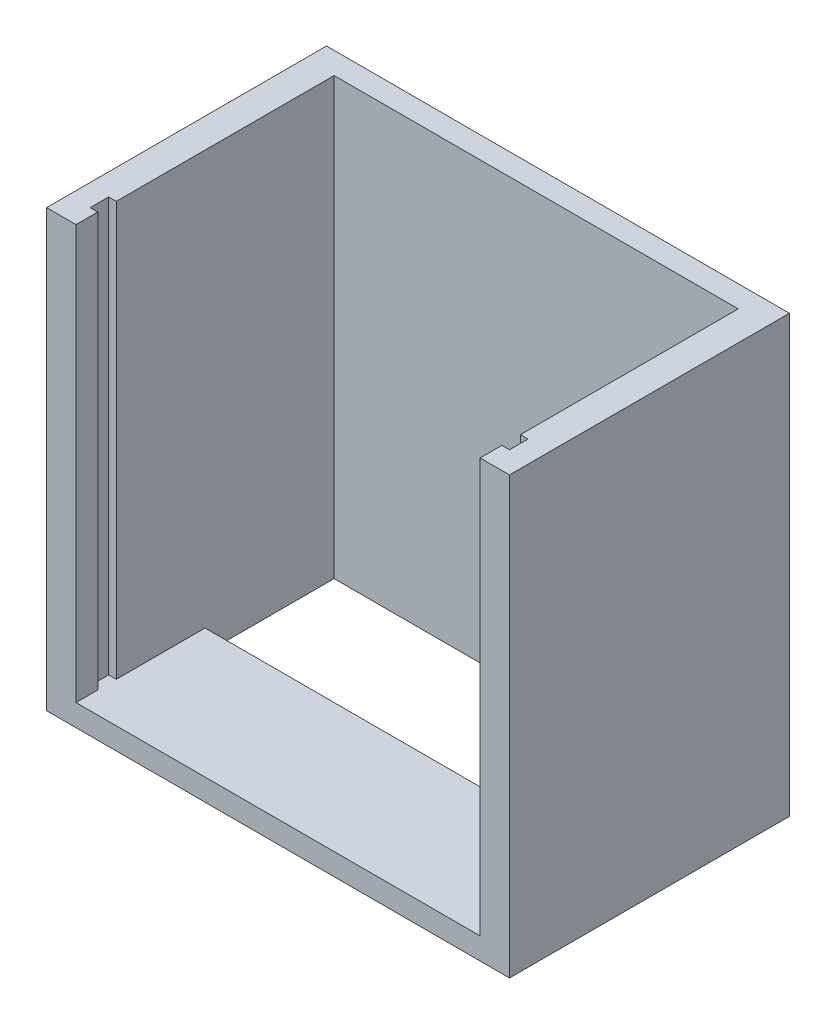
ISO-10303-21;
HEADER;
FILE_DESCRIPTION(('STEP AP214'),'2;1');
FILE_NAME('part.step','',(''),(''),'','','');
FILE_SCHEMA(('AUTOMOTIVE_DESIGN { 1 0 10303 214 1 1 1 1 }'));
ENDSEC;
DATA;
#1=APPLICATION_CONTEXT('core data for automotive mechanical design processes');
#2=APPLICATION_PROTOCOL_DEFINITION('international standard','automotive_design',2000,#1);
#3=PRODUCT_CONTEXT('',#1,'mechanical');
#4=PRODUCT('Part','Part','',(#3));
#5=PRODUCT_RELATED_PRODUCT_CATEGORY('part','',(#4));
#6=PRODUCT_DEFINITION_FORMATION('','',#4);
#7=PRODUCT_DEFINITION_CONTEXT('part definition',#1,'design');
#8=PRODUCT_DEFINITION('design','',#6,#7);
#9=PRODUCT_DEFINITION_SHAPE('','',#8);
#10=(LENGTH_UNIT() NAMED_UNIT(*) SI_UNIT(.MILLI.,.METRE.));
#11=(NAMED_UNIT(*) PLANE_ANGLE_UNIT() SI_UNIT($,.RADIAN.));
#12=(NAMED_UNIT(*) SI_UNIT($,.STERADIAN.) SOLID_ANGLE_UNIT());
#13=UNCERTAINTY_MEASURE_WITH_UNIT(LENGTH_MEASURE(1.E-05),#10,'distance_accuracy_value','');
#14=(GEOMETRIC_REPRESENTATION_CONTEXT(3) GLOBAL_UNCERTAINTY_ASSIGNED_CONTEXT((#13)) GLOBAL_UNIT_ASSIGNED_CONTEXT((#10,
#11,#12)) REPRESENTATION_CONTEXT('',''));
#15=CARTESIAN_POINT('',(0.,0.,0.));
#16=DIRECTION('',(0.,0.,1.));
#17=DIRECTION('',(1.,0.,0.));
#18=AXIS2_PLACEMENT_3D('',#15,#16,#17);
#19=CARTESIAN_POINT('',(0.,0.,0.));
#20=DIRECTION('',(0.,-1.,0.));
#21=DIRECTION('',(0.,0.,-1.));
#22=AXIS2_PLACEMENT_3D('',#19,#20,#21);
#23=PLANE('',#22);
#24=DIRECTION('',(0.,0.,1.));
#25=VECTOR('',#24,1.);
#26=CARTESIAN_POINT('',(-25.0989834024897,0.,0.));
#27=LINE('',#26,#25);
#28=CARTESIAN_POINT('',(-25.0989834024897,0.,16.2434647302905));
#29=VERTEX_POINT('',#28);
#30=CARTESIAN_POINT('',(-25.0989834024897,0.,24.3934647302905));
#31=VERTEX_POINT('',#30);
#32=EDGE_CURVE('E56',#29,#31,#27,.T.);
#33=ORIENTED_EDGE('',*,*,#32,.F.);
#34=DIRECTION('',(1.,0.,0.));
#35=VECTOR('',#34,1.);
#36=CARTESIAN_POINT('',(0.,0.,16.2434647302905));
#37=LINE('',#36,#35);
#38=CARTESIAN_POINT('',(-62.1989834024897,0.,16.2434647302905));
#39=VERTEX_POINT('',#38);
#40=EDGE_CURVE('E182',#39,#29,#37,.T.);
#41=ORIENTED_EDGE('',*,*,#40,.F.);
#42=DIRECTION('',(0.,0.,1.));
#43=VECTOR('',#42,1.);
#44=CARTESIAN_POINT('',(-62.1989834024897,0.,0.));
#45=LINE('',#44,#43);
#46=CARTESIAN_POINT('',(-62.1989834024897,0.,24.3934647302905));
#47=VERTEX_POINT('',#46);
#48=EDGE_CURVE('E167',#39,#47,#45,.T.);
#49=ORIENTED_EDGE('',*,*,#48,.T.);
#50=DIRECTION('',(1.,0.,0.));
#51=VECTOR('',#50,1.);
#52=CARTESIAN_POINT('',(0.,0.,24.3934647302905));
#53=LINE('',#52,#51);
#54=CARTESIAN_POINT('',(-62.8989834024897,0.,24.3934647302905));
#55=VERTEX_POINT('',#54);
#56=EDGE_CURVE('E288',#55,#47,#53,.T.);
#57=ORIENTED_EDGE('',*,*,#56,.F.);
#58=DIRECTION('',(0.,0.,1.));
#59=VECTOR('',#58,1.);
#60=CARTESIAN_POINT('',(-62.8989834024897,0.,0.));
#61=LINE('',#60,#59);
#62=CARTESIAN_POINT('',(-62.8989834024897,0.,26.0934647302905));
#63=VERTEX_POINT('',#62);
#64=EDGE_CURVE('E285',#55,#63,#61,.T.);
#65=ORIENTED_EDGE('',*,*,#64,.T.);
#66=DIRECTION('',(1.,0.,0.));
#67=VECTOR('',#66,1.);
#68=CARTESIAN_POINT('',(0.,0.,26.0934647302905));
#69=LINE('',#68,#67);
#70=CARTESIAN_POINT('',(-62.1989834024897,0.,26.0934647302905));
#71=VERTEX_POINT('',#70);
#72=EDGE_CURVE('E282',#63,#71,#69,.T.);
#73=ORIENTED_EDGE('',*,*,#72,.T.);
#74=CARTESIAN_POINT('',(-62.1989834024897,0.,28.0934647302905));
#75=VERTEX_POINT('',#74);
#76=EDGE_CURVE('E262',#71,#75,#45,.T.);
#77=ORIENTED_EDGE('',*,*,#76,.T.);
#78=DIRECTION('',(1.,0.,0.));
#79=VECTOR('',#78,1.);
#80=CARTESIAN_POINT('',(-64.8989834024897,0.,28.0934647302905));
#81=LINE('',#80,#79);
#82=CARTESIAN_POINT('',(-25.0989834024897,0.,28.0934647302905));
#83=VERTEX_POINT('',#82);
#84=EDGE_CURVE('E250',#75,#83,#81,.T.);
#85=ORIENTED_EDGE('',*,*,#84,.T.);
#86=CARTESIAN_POINT('',(-25.0989834024897,0.,26.0934647302905));
#87=VERTEX_POINT('',#86);
#88=EDGE_CURVE('E213',#87,#83,#27,.T.);
#89=ORIENTED_EDGE('',*,*,#88,.F.);
#90=DIRECTION('',(1.,0.,0.));
#91=VECTOR('',#90,1.);
#92=CARTESIAN_POINT('',(0.,0.,26.0934647302905));
#93=LINE('',#92,#91);
#94=CARTESIAN_POINT('',(-24.3989834024897,0.,26.0934647302905));
#95=VERTEX_POINT('',#94);
#96=EDGE_CURVE('E234',#87,#95,#93,.T.);
#97=ORIENTED_EDGE('',*,*,#96,.T.);
#98=DIRECTION('',(0.,0.,1.));
#99=VECTOR('',#98,1.);
#100=CARTESIAN_POINT('',(-24.3989834024897,0.,0.));
#101=LINE('',#100,#99);
#102=CARTESIAN_POINT('',(-24.3989834024897,0.,24.3934647302905));
#103=VERTEX_POINT('',#102);
#104=EDGE_CURVE('E231',#103,#95,#101,.T.);
#105=ORIENTED_EDGE('',*,*,#104,.F.);
#106=DIRECTION('',(1.,0.,0.));
#107=VECTOR('',#106,1.);
#108=CARTESIAN_POINT('',(0.,0.,24.3934647302905));
#109=LINE('',#108,#107);
#110=EDGE_CURVE('E228',#31,#103,#109,.T.);
#111=ORIENTED_EDGE('',*,*,#110,.F.);
#112=EDGE_LOOP('',(#33,#41,#49,#57,#65,#73,#77,#85,#89,#97,#105,#111));
#113=FACE_BOUND('',#112,.T.);
#114=ADVANCED_FACE('F35',(#113),#23,.F.);
#115=CARTESIAN_POINT('',(-64.8989834024897,38.,0.));
#116=DIRECTION('',(1.,0.,0.));
#117=DIRECTION('',(0.,0.,-1.));
#118=AXIS2_PLACEMENT_3D('',#115,#116,#117);
#119=PLANE('',#118);
#120=DIRECTION('',(0.,0.,1.));
#121=VECTOR('',#120,1.);
#122=CARTESIAN_POINT('',(-64.8989834024897,38.,0.));
#123=LINE('',#122,#121);
#124=CARTESIAN_POINT('',(-64.8989834024897,38.,2.39346473029046));
#125=VERTEX_POINT('',#124);
#126=CARTESIAN_POINT('',(-64.8989834024897,38.,28.0934647302905));
#127=VERTEX_POINT('',#126);
#128=EDGE_CURVE('E263',#125,#127,#123,.T.);
#129=ORIENTED_EDGE('',*,*,#128,.F.);
#130=DIRECTION('',(0.,1.,0.));
#131=VECTOR('',#130,1.);
#132=CARTESIAN_POINT('',(-64.8989834024897,38.,2.39346473029046));
#133=LINE('',#132,#131);
#134=CARTESIAN_POINT('',(-64.8989834024897,-2.,2.39346473029046));
#135=VERTEX_POINT('',#134);
#136=EDGE_CURVE('E196',#135,#125,#133,.T.);
#137=ORIENTED_EDGE('',*,*,#136,.F.);
#138=DIRECTION('',(0.,0.,1.));
#139=VECTOR('',#138,1.);
#140=CARTESIAN_POINT('',(-64.8989834024897,-2.,28.0934647302905));
#141=LINE('',#140,#139);
#142=CARTESIAN_POINT('',(-64.8989834024897,-2.,28.0934647302905));
#143=VERTEX_POINT('',#142);
#144=EDGE_CURVE('E251',#135,#143,#141,.T.);
#145=ORIENTED_EDGE('',*,*,#144,.T.);
#146=DIRECTION('',(0.,-1.,0.));
#147=VECTOR('',#146,1.);
#148=CARTESIAN_POINT('',(-64.8989834024897,38.,28.0934647302905));
#149=LINE('',#148,#147);
#150=EDGE_CURVE('E11',#127,#143,#149,.T.);
#151=ORIENTED_EDGE('',*,*,#150,.F.);
#152=EDGE_LOOP('',(#129,#137,#145,#151));
#153=FACE_BOUND('',#152,.T.);
#154=ADVANCED_FACE('F37',(#153),#119,.F.);
#155=CARTESIAN_POINT('',(0.,38.,28.0934647302905));
#156=DIRECTION('',(0.,0.,-1.));
#157=DIRECTION('',(-1.,0.,0.));
#158=AXIS2_PLACEMENT_3D('',#155,#156,#157);
#159=PLANE('',#158);
#160=ORIENTED_EDGE('',*,*,#150,.T.);
#161=DIRECTION('',(1.,0.,0.));
#162=VECTOR('',#161,1.);
#163=CARTESIAN_POINT('',(-64.8989834024897,-2.,28.0934647302905));
#164=LINE('',#163,#162);
#165=CARTESIAN_POINT('',(-22.3989834024897,-2.,28.0934647302905));
#166=VERTEX_POINT('',#165);
#167=EDGE_CURVE('E254',#143,#166,#164,.T.);
#168=ORIENTED_EDGE('',*,*,#167,.T.);
#169=DIRECTION('',(0.,1.,0.));
#170=VECTOR('',#169,1.);
#171=CARTESIAN_POINT('',(-22.3989834024897,-2.,28.0934647302905));
#172=LINE('',#171,#170);
#173=CARTESIAN_POINT('',(-22.3989834024897,38.,28.0934647302905));
#174=VERTEX_POINT('',#173);
#175=EDGE_CURVE('E259',#166,#174,#172,.T.);
#176=ORIENTED_EDGE('',*,*,#175,.T.);
#177=DIRECTION('',(1.,0.,0.));
#178=VECTOR('',#177,1.);
#179=CARTESIAN_POINT('',(0.,38.,28.0934647302905));
#180=LINE('',#179,#178);
#181=CARTESIAN_POINT('',(-25.0989834024897,38.,28.0934647302905));
#182=VERTEX_POINT('',#181);
#183=EDGE_CURVE('E223',#182,#174,#180,.T.);
#184=ORIENTED_EDGE('',*,*,#183,.F.);
#185=DIRECTION('',(0.,-1.,0.));
#186=VECTOR('',#185,1.);
#187=CARTESIAN_POINT('',(-25.0989834024897,38.,28.0934647302905));
#188=LINE('',#187,#186);
#189=EDGE_CURVE('E226',#182,#83,#188,.T.);
#190=ORIENTED_EDGE('',*,*,#189,.T.);
#191=ORIENTED_EDGE('',*,*,#84,.F.);
#192=DIRECTION('',(0.,-1.,0.));
#193=VECTOR('',#192,1.);
#194=CARTESIAN_POINT('',(-62.1989834024897,38.,28.0934647302905));
#195=LINE('',#194,#193);
#196=CARTESIAN_POINT('',(-62.1989834024897,38.,28.0934647302905));
#197=VERTEX_POINT('',#196);
#198=EDGE_CURVE('E43',#197,#75,#195,.T.);
#199=ORIENTED_EDGE('',*,*,#198,.F.);
#200=DIRECTION('',(1.,0.,0.));
#201=VECTOR('',#200,1.);
#202=CARTESIAN_POINT('',(0.,38.,28.0934647302905));
#203=LINE('',#202,#201);
#204=EDGE_CURVE('E266',#127,#197,#203,.T.);
#205=ORIENTED_EDGE('',*,*,#204,.F.);
#206=EDGE_LOOP('',(#160,#168,#176,#184,#190,#191,#199,#205));
#207=FACE_BOUND('',#206,.T.);
#208=ADVANCED_FACE('F308',(#207),#159,.F.);
#209=CARTESIAN_POINT('',(-62.1989834024897,38.,0.));
#210=DIRECTION('',(1.,0.,0.));
#211=DIRECTION('',(0.,0.,-1.));
#212=AXIS2_PLACEMENT_3D('',#209,#210,#211);
#213=PLANE('',#212);
#214=ORIENTED_EDGE('',*,*,#76,.F.);
#215=DIRECTION('',(0.,-1.,0.));
#216=VECTOR('',#215,1.);
#217=CARTESIAN_POINT('',(-62.1989834024897,38.,26.0934647302905));
#218=LINE('',#217,#216);
#219=CARTESIAN_POINT('',(-62.1989834024897,38.,26.0934647302905));
#220=VERTEX_POINT('',#219);
#221=EDGE_CURVE('E297',#220,#71,#218,.T.);
#222=ORIENTED_EDGE('',*,*,#221,.F.);
#223=DIRECTION('',(0.,0.,1.));
#224=VECTOR('',#223,1.);
#225=CARTESIAN_POINT('',(-62.1989834024897,38.,0.));
#226=LINE('',#225,#224);
#227=EDGE_CURVE('E268',#220,#197,#226,.T.);
#228=ORIENTED_EDGE('',*,*,#227,.T.);
#229=ORIENTED_EDGE('',*,*,#198,.T.);
#230=EDGE_LOOP('',(#214,#222,#228,#229));
#231=FACE_BOUND('',#230,.T.);
#232=ADVANCED_FACE('F301',(#231),#213,.T.);
#233=CARTESIAN_POINT('',(0.,38.,26.0934647302905));
#234=DIRECTION('',(0.,0.,-1.));
#235=DIRECTION('',(-1.,0.,0.));
#236=AXIS2_PLACEMENT_3D('',#233,#234,#235);
#237=PLANE('',#236);
#238=ORIENTED_EDGE('',*,*,#72,.F.);
#239=DIRECTION('',(0.,-1.,0.));
#240=VECTOR('',#239,1.);
#241=CARTESIAN_POINT('',(-62.8989834024897,38.,26.0934647302905));
#242=LINE('',#241,#240);
#243=CARTESIAN_POINT('',(-62.8989834024897,38.,26.0934647302905));
#244=VERTEX_POINT('',#243);
#245=EDGE_CURVE('E295',#244,#63,#242,.T.);
#246=ORIENTED_EDGE('',*,*,#245,.F.);
#247=DIRECTION('',(1.,0.,0.));
#248=VECTOR('',#247,1.);
#249=CARTESIAN_POINT('',(0.,38.,26.0934647302905));
#250=LINE('',#249,#248);
#251=EDGE_CURVE('E271',#244,#220,#250,.T.);
#252=ORIENTED_EDGE('',*,*,#251,.T.);
#253=ORIENTED_EDGE('',*,*,#221,.T.);
#254=EDGE_LOOP('',(#238,#246,#252,#253));
#255=FACE_BOUND('',#254,.T.);
#256=ADVANCED_FACE('F338',(#255),#237,.T.);
#257=CARTESIAN_POINT('',(-62.8989834024897,38.,0.));
#258=DIRECTION('',(1.,0.,0.));
#259=DIRECTION('',(0.,0.,-1.));
#260=AXIS2_PLACEMENT_3D('',#257,#258,#259);
#261=PLANE('',#260);
#262=ORIENTED_EDGE('',*,*,#64,.F.);
#263=DIRECTION('',(0.,-1.,0.));
#264=VECTOR('',#263,1.);
#265=CARTESIAN_POINT('',(-62.8989834024897,38.,24.3934647302905));
#266=LINE('',#265,#264);
#267=CARTESIAN_POINT('',(-62.8989834024897,38.,24.3934647302905));
#268=VERTEX_POINT('',#267);
#269=EDGE_CURVE('E293',#268,#55,#266,.T.);
#270=ORIENTED_EDGE('',*,*,#269,.F.);
#271=DIRECTION('',(0.,0.,1.));
#272=VECTOR('',#271,1.);
#273=CARTESIAN_POINT('',(-62.8989834024897,38.,0.));
#274=LINE('',#273,#272);
#275=EDGE_CURVE('E275',#268,#244,#274,.T.);
#276=ORIENTED_EDGE('',*,*,#275,.T.);
#277=ORIENTED_EDGE('',*,*,#245,.T.);
#278=EDGE_LOOP('',(#262,#270,#276,#277));
#279=FACE_BOUND('',#278,.T.);
#280=ADVANCED_FACE('F335',(#279),#261,.T.);
#281=CARTESIAN_POINT('',(0.,38.,24.3934647302905));
#282=DIRECTION('',(0.,0.,-1.));
#283=DIRECTION('',(-1.,0.,0.));
#284=AXIS2_PLACEMENT_3D('',#281,#282,#283);
#285=PLANE('',#284);
#286=ORIENTED_EDGE('',*,*,#56,.T.);
#287=DIRECTION('',(0.,-1.,0.));
#288=VECTOR('',#287,1.);
#289=CARTESIAN_POINT('',(-62.1989834024897,38.,24.3934647302905));
#290=LINE('',#289,#288);
#291=CARTESIAN_POINT('',(-62.1989834024897,38.,24.3934647302905));
#292=VERTEX_POINT('',#291);
#293=EDGE_CURVE('E291',#292,#47,#290,.T.);
#294=ORIENTED_EDGE('',*,*,#293,.F.);
#295=DIRECTION('',(1.,0.,0.));
#296=VECTOR('',#295,1.);
#297=CARTESIAN_POINT('',(0.,38.,24.3934647302905));
#298=LINE('',#297,#296);
#299=EDGE_CURVE('E278',#268,#292,#298,.T.);
#300=ORIENTED_EDGE('',*,*,#299,.F.);
#301=ORIENTED_EDGE('',*,*,#269,.T.);
#302=EDGE_LOOP('',(#286,#294,#300,#301));
#303=FACE_BOUND('',#302,.T.);
#304=ADVANCED_FACE('F331',(#303),#285,.F.);
#305=ORIENTED_EDGE('',*,*,#48,.F.);
#306=DIRECTION('',(0.,1.,0.));
#307=VECTOR('',#306,1.);
#308=CARTESIAN_POINT('',(-62.1989834024897,-2.,16.2434647302905));
#309=LINE('',#308,#307);
#310=CARTESIAN_POINT('',(-62.1989834024897,-2.,16.2434647302905));
#311=VERTEX_POINT('',#310);
#312=EDGE_CURVE('E159',#311,#39,#309,.T.);
#313=ORIENTED_EDGE('',*,*,#312,.F.);
#314=DIRECTION('',(0.,0.,1.));
#315=VECTOR('',#314,1.);
#316=CARTESIAN_POINT('',(-62.1989834024897,-2.,0.));
#317=LINE('',#316,#315);
#318=CARTESIAN_POINT('',(-62.1989834024897,-2.,4.39346473029046));
#319=VERTEX_POINT('',#318);
#320=EDGE_CURVE('E164',#319,#311,#317,.T.);
#321=ORIENTED_EDGE('',*,*,#320,.F.);
#322=DIRECTION('',(0.,-1.,0.));
#323=VECTOR('',#322,1.);
#324=CARTESIAN_POINT('',(-62.1989834024897,0.,4.39346473029046));
#325=LINE('',#324,#323);
#326=CARTESIAN_POINT('',(-62.1989834024897,38.,4.39346473029046));
#327=VERTEX_POINT('',#326);
#328=EDGE_CURVE('E202',#327,#319,#325,.T.);
#329=ORIENTED_EDGE('',*,*,#328,.F.);
#330=EDGE_CURVE('E272',#327,#292,#226,.T.);
#331=ORIENTED_EDGE('',*,*,#330,.T.);
#332=ORIENTED_EDGE('',*,*,#293,.T.);
#333=EDGE_LOOP('',(#305,#313,#321,#329,#331,#332));
#334=FACE_BOUND('',#333,.T.);
#335=ADVANCED_FACE('F161',(#334),#213,.T.);
#336=CARTESIAN_POINT('',(0.,38.,0.));
#337=DIRECTION('',(0.,1.,0.));
#338=DIRECTION('',(0.,0.,1.));
#339=AXIS2_PLACEMENT_3D('',#336,#337,#338);
#340=PLANE('',#339);
#341=ORIENTED_EDGE('',*,*,#128,.T.);
#342=ORIENTED_EDGE('',*,*,#204,.T.);
#343=ORIENTED_EDGE('',*,*,#227,.F.);
#344=ORIENTED_EDGE('',*,*,#251,.F.);
#345=ORIENTED_EDGE('',*,*,#275,.F.);
#346=ORIENTED_EDGE('',*,*,#299,.T.);
#347=ORIENTED_EDGE('',*,*,#330,.F.);
#348=DIRECTION('',(1.,0.,0.));
#349=VECTOR('',#348,1.);
#350=CARTESIAN_POINT('',(-22.3989834024897,38.,4.39346473029046));
#351=LINE('',#350,#349);
#352=CARTESIAN_POINT('',(-25.0989834024897,38.,4.39346473029046));
#353=VERTEX_POINT('',#352);
#354=EDGE_CURVE('E188',#327,#353,#351,.T.);
#355=ORIENTED_EDGE('',*,*,#354,.T.);
#356=DIRECTION('',(0.,0.,1.));
#357=VECTOR('',#356,1.);
#358=CARTESIAN_POINT('',(-25.0989834024897,38.,0.));
#359=LINE('',#358,#357);
#360=CARTESIAN_POINT('',(-25.0989834024897,38.,24.3934647302905));
#361=VERTEX_POINT('',#360);
#362=EDGE_CURVE('E212',#353,#361,#359,.T.);
#363=ORIENTED_EDGE('',*,*,#362,.T.);
#364=DIRECTION('',(1.,0.,0.));
#365=VECTOR('',#364,1.);
#366=CARTESIAN_POINT('',(0.,38.,24.3934647302905));
#367=LINE('',#366,#365);
#368=CARTESIAN_POINT('',(-24.3989834024897,38.,24.3934647302905));
#369=VERTEX_POINT('',#368);
#370=EDGE_CURVE('E215',#361,#369,#367,.T.);
#371=ORIENTED_EDGE('',*,*,#370,.T.);
#372=DIRECTION('',(0.,0.,1.));
#373=VECTOR('',#372,1.);
#374=CARTESIAN_POINT('',(-24.3989834024897,38.,0.));
#375=LINE('',#374,#373);
#376=CARTESIAN_POINT('',(-24.3989834024897,38.,26.0934647302905));
#377=VERTEX_POINT('',#376);
#378=EDGE_CURVE('E218',#369,#377,#375,.T.);
#379=ORIENTED_EDGE('',*,*,#378,.T.);
#380=DIRECTION('',(1.,0.,0.));
#381=VECTOR('',#380,1.);
#382=CARTESIAN_POINT('',(0.,38.,26.0934647302905));
#383=LINE('',#382,#381);
#384=CARTESIAN_POINT('',(-25.0989834024897,38.,26.0934647302905));
#385=VERTEX_POINT('',#384);
#386=EDGE_CURVE('E220',#385,#377,#383,.T.);
#387=ORIENTED_EDGE('',*,*,#386,.F.);
#388=EDGE_CURVE('E216',#385,#182,#359,.T.);
#389=ORIENTED_EDGE('',*,*,#388,.T.);
#390=ORIENTED_EDGE('',*,*,#183,.T.);
#391=DIRECTION('',(0.,0.,1.));
#392=VECTOR('',#391,1.);
#393=CARTESIAN_POINT('',(-22.3989834024897,38.,0.));
#394=LINE('',#393,#392);
#395=CARTESIAN_POINT('',(-22.3989834024897,38.,2.39346473029046));
#396=VERTEX_POINT('',#395);
#397=EDGE_CURVE('E209',#396,#174,#394,.T.);
#398=ORIENTED_EDGE('',*,*,#397,.F.);
#399=DIRECTION('',(1.,0.,0.));
#400=VECTOR('',#399,1.);
#401=CARTESIAN_POINT('',(-22.3989834024897,38.,2.39346473029046));
#402=LINE('',#401,#400);
#403=EDGE_CURVE('E199',#125,#396,#402,.T.);
#404=ORIENTED_EDGE('',*,*,#403,.F.);
#405=EDGE_LOOP('',(#341,#342,#343,#344,#345,#346,#347,#355,#363,#371,#379,#387,#389,#390,#398,#404));
#406=FACE_BOUND('',#405,.T.);
#407=ADVANCED_FACE('F340',(#406),#340,.T.);
#408=CARTESIAN_POINT('',(-22.3989834024897,-2.,28.0934647302905));
#409=DIRECTION('',(1.,0.,0.));
#410=DIRECTION('',(0.,0.,-1.));
#411=AXIS2_PLACEMENT_3D('',#408,#409,#410);
#412=PLANE('',#411);
#413=DIRECTION('',(0.,0.,-1.));
#414=VECTOR('',#413,1.);
#415=CARTESIAN_POINT('',(-22.3989834024897,-2.,28.0934647302905));
#416=LINE('',#415,#414);
#417=CARTESIAN_POINT('',(-22.3989834024897,-2.,2.39346473029046));
#418=VERTEX_POINT('',#417);
#419=EDGE_CURVE('E257',#166,#418,#416,.T.);
#420=ORIENTED_EDGE('',*,*,#419,.T.);
#421=DIRECTION('',(0.,-1.,0.));
#422=VECTOR('',#421,1.);
#423=CARTESIAN_POINT('',(-22.3989834024897,38.,2.39346473029046));
#424=LINE('',#423,#422);
#425=EDGE_CURVE('E190',#396,#418,#424,.T.);
#426=ORIENTED_EDGE('',*,*,#425,.F.);
#427=ORIENTED_EDGE('',*,*,#397,.T.);
#428=ORIENTED_EDGE('',*,*,#175,.F.);
#429=EDGE_LOOP('',(#420,#426,#427,#428));
#430=FACE_BOUND('',#429,.T.);
#431=ADVANCED_FACE('F352',(#430),#412,.T.);
#432=CARTESIAN_POINT('',(0.,-2.,0.));
#433=DIRECTION('',(0.,-1.,0.));
#434=DIRECTION('',(0.,0.,-1.));
#435=AXIS2_PLACEMENT_3D('',#432,#433,#434);
#436=PLANE('',#435);
#437=ORIENTED_EDGE('',*,*,#320,.T.);
#438=DIRECTION('',(1.,0.,0.));
#439=VECTOR('',#438,1.);
#440=CARTESIAN_POINT('',(0.,-2.,16.2434647302905));
#441=LINE('',#440,#439);
#442=CARTESIAN_POINT('',(-25.0989834024897,-2.,16.2434647302905));
#443=VERTEX_POINT('',#442);
#444=EDGE_CURVE('E175',#311,#443,#441,.T.);
#445=ORIENTED_EDGE('',*,*,#444,.T.);
#446=DIRECTION('',(0.,0.,-1.));
#447=VECTOR('',#446,1.);
#448=CARTESIAN_POINT('',(-25.0989834024897,-2.,0.));
#449=LINE('',#448,#447);
#450=CARTESIAN_POINT('',(-25.0989834024897,-2.,4.39346473029046));
#451=VERTEX_POINT('',#450);
#452=EDGE_CURVE('E50',#443,#451,#449,.T.);
#453=ORIENTED_EDGE('',*,*,#452,.T.);
#454=DIRECTION('',(-1.,0.,0.));
#455=VECTOR('',#454,1.);
#456=CARTESIAN_POINT('',(0.,-2.,4.39346473029046));
#457=LINE('',#456,#455);
#458=EDGE_CURVE('E172',#451,#319,#457,.T.);
#459=ORIENTED_EDGE('',*,*,#458,.T.);
#460=EDGE_LOOP('',(#437,#445,#453,#459));
#461=FACE_BOUND('',#460,.T.);
#462=ORIENTED_EDGE('',*,*,#144,.F.);
#463=DIRECTION('',(-1.,0.,0.));
#464=VECTOR('',#463,1.);
#465=CARTESIAN_POINT('',(-22.3989834024897,-2.,2.39346473029046));
#466=LINE('',#465,#464);
#467=EDGE_CURVE('E193',#418,#135,#466,.T.);
#468=ORIENTED_EDGE('',*,*,#467,.F.);
#469=ORIENTED_EDGE('',*,*,#419,.F.);
#470=ORIENTED_EDGE('',*,*,#167,.F.);
#471=EDGE_LOOP('',(#462,#468,#469,#470));
#472=FACE_BOUND('',#471,.T.);
#473=ADVANCED_FACE('F179',(#461,#472),#436,.T.);
#474=CARTESIAN_POINT('',(-25.0989834024897,38.,0.));
#475=DIRECTION('',(1.,0.,0.));
#476=DIRECTION('',(0.,0.,-1.));
#477=AXIS2_PLACEMENT_3D('',#474,#475,#476);
#478=PLANE('',#477);
#479=DIRECTION('',(0.,1.,0.));
#480=VECTOR('',#479,1.);
#481=CARTESIAN_POINT('',(-25.0989834024897,0.,4.39346473029046));
#482=LINE('',#481,#480);
#483=EDGE_CURVE('E206',#451,#353,#482,.T.);
#484=ORIENTED_EDGE('',*,*,#483,.F.);
#485=ORIENTED_EDGE('',*,*,#452,.F.);
#486=DIRECTION('',(0.,1.,0.));
#487=VECTOR('',#486,1.);
#488=CARTESIAN_POINT('',(-25.0989834024897,-2.,16.2434647302905));
#489=LINE('',#488,#487);
#490=EDGE_CURVE('E171',#443,#29,#489,.T.);
#491=ORIENTED_EDGE('',*,*,#490,.T.);
#492=ORIENTED_EDGE('',*,*,#32,.T.);
#493=DIRECTION('',(0.,-1.,0.));
#494=VECTOR('',#493,1.);
#495=CARTESIAN_POINT('',(-25.0989834024897,38.,24.3934647302905));
#496=LINE('',#495,#494);
#497=EDGE_CURVE('E247',#361,#31,#496,.T.);
#498=ORIENTED_EDGE('',*,*,#497,.F.);
#499=ORIENTED_EDGE('',*,*,#362,.F.);
#500=EDGE_LOOP('',(#484,#485,#491,#492,#498,#499));
#501=FACE_BOUND('',#500,.T.);
#502=ADVANCED_FACE('F359',(#501),#478,.F.);
#503=CARTESIAN_POINT('',(0.,38.,24.3934647302905));
#504=DIRECTION('',(0.,0.,-1.));
#505=DIRECTION('',(-1.,0.,0.));
#506=AXIS2_PLACEMENT_3D('',#503,#504,#505);
#507=PLANE('',#506);
#508=ORIENTED_EDGE('',*,*,#110,.T.);
#509=DIRECTION('',(0.,-1.,0.));
#510=VECTOR('',#509,1.);
#511=CARTESIAN_POINT('',(-24.3989834024897,38.,24.3934647302905));
#512=LINE('',#511,#510);
#513=EDGE_CURVE('E244',#369,#103,#512,.T.);
#514=ORIENTED_EDGE('',*,*,#513,.F.);
#515=ORIENTED_EDGE('',*,*,#370,.F.);
#516=ORIENTED_EDGE('',*,*,#497,.T.);
#517=EDGE_LOOP('',(#508,#514,#515,#516));
#518=FACE_BOUND('',#517,.T.);
#519=ADVANCED_FACE('F325',(#518),#507,.F.);
#520=CARTESIAN_POINT('',(-24.3989834024897,38.,0.));
#521=DIRECTION('',(1.,0.,0.));
#522=DIRECTION('',(0.,0.,-1.));
#523=AXIS2_PLACEMENT_3D('',#520,#521,#522);
#524=PLANE('',#523);
#525=ORIENTED_EDGE('',*,*,#104,.T.);
#526=DIRECTION('',(0.,-1.,0.));
#527=VECTOR('',#526,1.);
#528=CARTESIAN_POINT('',(-24.3989834024897,38.,26.0934647302905));
#529=LINE('',#528,#527);
#530=EDGE_CURVE('E241',#377,#95,#529,.T.);
#531=ORIENTED_EDGE('',*,*,#530,.F.);
#532=ORIENTED_EDGE('',*,*,#378,.F.);
#533=ORIENTED_EDGE('',*,*,#513,.T.);
#534=EDGE_LOOP('',(#525,#531,#532,#533));
#535=FACE_BOUND('',#534,.T.);
#536=ADVANCED_FACE('F321',(#535),#524,.F.);
#537=CARTESIAN_POINT('',(0.,38.,26.0934647302905));
#538=DIRECTION('',(0.,0.,-1.));
#539=DIRECTION('',(-1.,0.,0.));
#540=AXIS2_PLACEMENT_3D('',#537,#538,#539);
#541=PLANE('',#540);
#542=ORIENTED_EDGE('',*,*,#96,.F.);
#543=DIRECTION('',(0.,-1.,0.));
#544=VECTOR('',#543,1.);
#545=CARTESIAN_POINT('',(-25.0989834024897,38.,26.0934647302905));
#546=LINE('',#545,#544);
#547=EDGE_CURVE('E238',#385,#87,#546,.T.);
#548=ORIENTED_EDGE('',*,*,#547,.F.);
#549=ORIENTED_EDGE('',*,*,#386,.T.);
#550=ORIENTED_EDGE('',*,*,#530,.T.);
#551=EDGE_LOOP('',(#542,#548,#549,#550));
#552=FACE_BOUND('',#551,.T.);
#553=ADVANCED_FACE('F318',(#552),#541,.T.);
#554=ORIENTED_EDGE('',*,*,#88,.T.);
#555=ORIENTED_EDGE('',*,*,#189,.F.);
#556=ORIENTED_EDGE('',*,*,#388,.F.);
#557=ORIENTED_EDGE('',*,*,#547,.T.);
#558=EDGE_LOOP('',(#554,#555,#556,#557));
#559=FACE_BOUND('',#558,.T.);
#560=ADVANCED_FACE('F313',(#559),#478,.F.);
#561=CARTESIAN_POINT('',(0.,0.,4.39346473029046));
#562=DIRECTION('',(0.,0.,-1.));
#563=DIRECTION('',(-1.,0.,0.));
#564=AXIS2_PLACEMENT_3D('',#561,#562,#563);
#565=PLANE('',#564);
#566=ORIENTED_EDGE('',*,*,#354,.F.);
#567=ORIENTED_EDGE('',*,*,#328,.T.);
#568=ORIENTED_EDGE('',*,*,#458,.F.);
#569=ORIENTED_EDGE('',*,*,#483,.T.);
#570=EDGE_LOOP('',(#566,#567,#568,#569));
#571=FACE_BOUND('',#570,.T.);
#572=ADVANCED_FACE('F376',(#571),#565,.F.);
#573=CARTESIAN_POINT('',(0.,0.,2.39346473029046));
#574=DIRECTION('',(0.,0.,-1.));
#575=DIRECTION('',(-1.,0.,0.));
#576=AXIS2_PLACEMENT_3D('',#573,#574,#575);
#577=PLANE('',#576);
#578=ORIENTED_EDGE('',*,*,#425,.T.);
#579=ORIENTED_EDGE('',*,*,#467,.T.);
#580=ORIENTED_EDGE('',*,*,#136,.T.);
#581=ORIENTED_EDGE('',*,*,#403,.T.);
#582=EDGE_LOOP('',(#578,#579,#580,#581));
#583=FACE_BOUND('',#582,.T.);
#584=ADVANCED_FACE('F349',(#583),#577,.T.);
#585=CARTESIAN_POINT('',(0.,-2.,16.2434647302905));
#586=DIRECTION('',(0.,0.,1.));
#587=DIRECTION('',(1.,0.,0.));
#588=AXIS2_PLACEMENT_3D('',#585,#586,#587);
#589=PLANE('',#588);
#590=ORIENTED_EDGE('',*,*,#40,.T.);
#591=ORIENTED_EDGE('',*,*,#490,.F.);
#592=ORIENTED_EDGE('',*,*,#444,.F.);
#593=ORIENTED_EDGE('',*,*,#312,.T.);
#594=EDGE_LOOP('',(#590,#591,#592,#593));
#595=FACE_BOUND('',#594,.T.);
#596=ADVANCED_FACE('F176',(#595),#589,.F.);
#597=CLOSED_SHELL('',(#114,#154,#208,#232,#256,#280,#304,#335,#407,#431,#473,#502,#519,#536,
#553,#560,#572,#584,#596));
#598=MANIFOLD_SOLID_BREP('B2',#597);
#599=ADVANCED_BREP_SHAPE_REPRESENTATION('',(#18,#598),#14);
#600=SHAPE_DEFINITION_REPRESENTATION(#9,#599);
ENDSEC;
END-ISO-10303-21;
